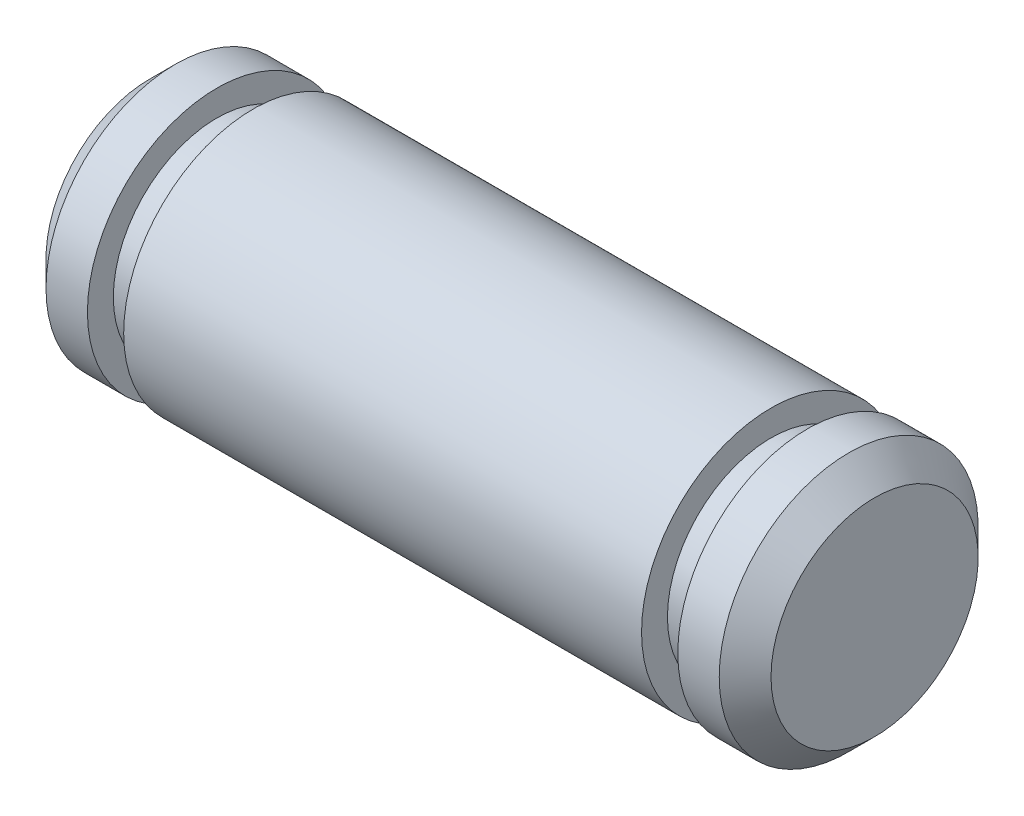
ISO-10303-21;
HEADER;
FILE_DESCRIPTION(('STEP AP214'),'2;1');
FILE_NAME('part.step','',(''),(''),'','','');
FILE_SCHEMA(('AUTOMOTIVE_DESIGN { 1 0 10303 214 1 1 1 1 }'));
ENDSEC;
DATA;
#1=APPLICATION_CONTEXT('core data for automotive mechanical design processes');
#2=APPLICATION_PROTOCOL_DEFINITION('international standard','automotive_design',2000,#1);
#3=PRODUCT_CONTEXT('',#1,'mechanical');
#4=PRODUCT('Part','Part','',(#3));
#5=PRODUCT_RELATED_PRODUCT_CATEGORY('part','',(#4));
#6=PRODUCT_DEFINITION_FORMATION('','',#4);
#7=PRODUCT_DEFINITION_CONTEXT('part definition',#1,'design');
#8=PRODUCT_DEFINITION('design','',#6,#7);
#9=PRODUCT_DEFINITION_SHAPE('','',#8);
#10=(LENGTH_UNIT() NAMED_UNIT(*) SI_UNIT(.MILLI.,.METRE.));
#11=(NAMED_UNIT(*) PLANE_ANGLE_UNIT() SI_UNIT($,.RADIAN.));
#12=(NAMED_UNIT(*) SI_UNIT($,.STERADIAN.) SOLID_ANGLE_UNIT());
#13=UNCERTAINTY_MEASURE_WITH_UNIT(LENGTH_MEASURE(1.E-05),#10,'distance_accuracy_value','');
#14=(GEOMETRIC_REPRESENTATION_CONTEXT(3) GLOBAL_UNCERTAINTY_ASSIGNED_CONTEXT((#13)) GLOBAL_UNIT_ASSIGNED_CONTEXT((#10,
#11,#12)) REPRESENTATION_CONTEXT('',''));
#15=CARTESIAN_POINT('',(0.,0.,0.));
#16=DIRECTION('',(0.,0.,1.));
#17=DIRECTION('',(1.,0.,0.));
#18=AXIS2_PLACEMENT_3D('',#15,#16,#17);
#19=CARTESIAN_POINT('',(14.,2.,0.));
#20=DIRECTION('',(-1.,0.,0.));
#21=DIRECTION('',(0.,0.,1.));
#22=AXIS2_PLACEMENT_3D('',#19,#20,#21);
#23=PLANE('',#22);
#24=CARTESIAN_POINT('',(14.00000000001,0.,0.));
#25=DIRECTION('',(-1.,0.,0.));
#26=DIRECTION('',(0.,0.,1.));
#27=AXIS2_PLACEMENT_3D('',#24,#25,#26);
#28=CIRCLE('',#27,1.99999999995271);
#29=CARTESIAN_POINT('',(14.00000000001,0.,1.99999999995271));
#30=VERTEX_POINT('',#29);
#31=EDGE_CURVE('E17',#30,#30,#28,.T.);
#32=ORIENTED_EDGE('',*,*,#31,.F.);
#33=EDGE_LOOP('',(#32));
#34=FACE_BOUND('',#33,.T.);
#35=ADVANCED_FACE('F14',(#34),#23,.F.);
#36=CARTESIAN_POINT('',(0.,0.,0.));
#37=DIRECTION('',(1.,0.,0.));
#38=DIRECTION('',(0.,0.,-1.));
#39=AXIS2_PLACEMENT_3D('',#36,#37,#38);
#40=PLANE('',#39);
#41=CARTESIAN_POINT('',(5.6843418860808E-11,0.,0.));
#42=DIRECTION('',(1.,0.,0.));
#43=DIRECTION('',(0.,0.,-1.));
#44=AXIS2_PLACEMENT_3D('',#41,#42,#43);
#45=CIRCLE('',#44,2.00000000000955);
#46=CARTESIAN_POINT('',(5.6843418860808E-11,0.,-2.00000000000955));
#47=VERTEX_POINT('',#46);
#48=EDGE_CURVE('E49',#47,#47,#45,.T.);
#49=ORIENTED_EDGE('',*,*,#48,.F.);
#50=EDGE_LOOP('',(#49));
#51=FACE_BOUND('',#50,.T.);
#52=ADVANCED_FACE('F61',(#51),#40,.F.);
#53=CARTESIAN_POINT('',(13.5000000000218,0.,0.));
#54=DIRECTION('',(-1.,0.,0.));
#55=DIRECTION('',(0.,0.,1.));
#56=AXIS2_PLACEMENT_3D('',#53,#54,#55);
#57=CONICAL_SURFACE('',#56,2.49999999994088,0.785398163397448);
#58=CARTESIAN_POINT('',(13.5,0.,0.));
#59=DIRECTION('',(-1.,0.,0.));
#60=DIRECTION('',(0.,0.,1.));
#61=AXIS2_PLACEMENT_3D('',#58,#59,#60);
#62=CIRCLE('',#61,2.5);
#63=CARTESIAN_POINT('',(13.5,0.,2.5));
#64=VERTEX_POINT('',#63);
#65=EDGE_CURVE('E51',#64,#64,#62,.T.);
#66=ORIENTED_EDGE('',*,*,#65,.F.);
#67=EDGE_LOOP('',(#66));
#68=FACE_BOUND('',#67,.T.);
#69=ORIENTED_EDGE('',*,*,#31,.T.);
#70=EDGE_LOOP('',(#69));
#71=FACE_BOUND('',#70,.T.);
#72=ADVANCED_FACE('F58',(#68,#71),#57,.T.);
#73=CARTESIAN_POINT('',(0.499999999988177,0.,0.));
#74=DIRECTION('',(1.,0.,0.));
#75=DIRECTION('',(0.,0.,-1.));
#76=AXIS2_PLACEMENT_3D('',#73,#74,#75);
#77=CONICAL_SURFACE('',#76,2.49999999994088,0.785398163397448);
#78=ORIENTED_EDGE('',*,*,#48,.T.);
#79=EDGE_LOOP('',(#78));
#80=FACE_BOUND('',#79,.T.);
#81=CARTESIAN_POINT('',(0.5,0.,0.));
#82=DIRECTION('',(-1.,0.,0.));
#83=DIRECTION('',(0.,0.,1.));
#84=AXIS2_PLACEMENT_3D('',#81,#82,#83);
#85=CIRCLE('',#84,2.5);
#86=CARTESIAN_POINT('',(0.5,0.,2.5));
#87=VERTEX_POINT('',#86);
#88=EDGE_CURVE('E48',#87,#87,#85,.F.);
#89=ORIENTED_EDGE('',*,*,#88,.F.);
#90=EDGE_LOOP('',(#89));
#91=FACE_BOUND('',#90,.T.);
#92=ADVANCED_FACE('F105',(#80,#91),#77,.T.);
#93=CARTESIAN_POINT('',(14.,0.,0.));
#94=DIRECTION('',(-1.,0.,0.));
#95=DIRECTION('',(0.,0.,1.));
#96=AXIS2_PLACEMENT_3D('',#93,#94,#95);
#97=CYLINDRICAL_SURFACE('',#96,2.5);
#98=CARTESIAN_POINT('',(12.7,0.,0.));
#99=DIRECTION('',(-1.,0.,0.));
#100=DIRECTION('',(0.,0.,1.));
#101=AXIS2_PLACEMENT_3D('',#98,#99,#100);
#102=CIRCLE('',#101,2.5);
#103=CARTESIAN_POINT('',(12.7,0.,2.5));
#104=VERTEX_POINT('',#103);
#105=EDGE_CURVE('E46',#104,#104,#102,.F.);
#106=ORIENTED_EDGE('',*,*,#105,.T.);
#107=EDGE_LOOP('',(#106));
#108=FACE_BOUND('',#107,.T.);
#109=ORIENTED_EDGE('',*,*,#65,.T.);
#110=EDGE_LOOP('',(#109));
#111=FACE_BOUND('',#110,.T.);
#112=ADVANCED_FACE('F101',(#108,#111),#97,.T.);
#113=CARTESIAN_POINT('',(14.,0.,0.));
#114=DIRECTION('',(-1.,0.,0.));
#115=DIRECTION('',(0.,0.,1.));
#116=AXIS2_PLACEMENT_3D('',#113,#114,#115);
#117=CYLINDRICAL_SURFACE('',#116,2.5);
#118=ORIENTED_EDGE('',*,*,#88,.T.);
#119=EDGE_LOOP('',(#118));
#120=FACE_BOUND('',#119,.T.);
#121=CARTESIAN_POINT('',(1.3,0.,0.));
#122=DIRECTION('',(-1.,0.,0.));
#123=DIRECTION('',(0.,0.,1.));
#124=AXIS2_PLACEMENT_3D('',#121,#122,#123);
#125=CIRCLE('',#124,2.5);
#126=CARTESIAN_POINT('',(1.3,0.,2.5));
#127=VERTEX_POINT('',#126);
#128=EDGE_CURVE('E43',#127,#127,#125,.T.);
#129=ORIENTED_EDGE('',*,*,#128,.T.);
#130=EDGE_LOOP('',(#129));
#131=FACE_BOUND('',#130,.T.);
#132=ADVANCED_FACE('F97',(#120,#131),#117,.T.);
#133=CARTESIAN_POINT('',(12.7,2.,0.));
#134=DIRECTION('',(1.,0.,0.));
#135=DIRECTION('',(0.,0.,-1.));
#136=AXIS2_PLACEMENT_3D('',#133,#134,#135);
#137=PLANE('',#136);
#138=CARTESIAN_POINT('',(12.7,0.,0.));
#139=DIRECTION('',(-1.,0.,0.));
#140=DIRECTION('',(0.,0.,1.));
#141=AXIS2_PLACEMENT_3D('',#138,#139,#140);
#142=CIRCLE('',#141,2.);
#143=CARTESIAN_POINT('',(12.7,0.,2.));
#144=VERTEX_POINT('',#143);
#145=EDGE_CURVE('E40',#144,#144,#142,.T.);
#146=ORIENTED_EDGE('',*,*,#145,.F.);
#147=EDGE_LOOP('',(#146));
#148=FACE_BOUND('',#147,.T.);
#149=ORIENTED_EDGE('',*,*,#105,.F.);
#150=EDGE_LOOP('',(#149));
#151=FACE_BOUND('',#150,.T.);
#152=ADVANCED_FACE('F93',(#148,#151),#137,.F.);
#153=CARTESIAN_POINT('',(1.3,2.5,0.));
#154=DIRECTION('',(-1.,0.,0.));
#155=DIRECTION('',(0.,0.,1.));
#156=AXIS2_PLACEMENT_3D('',#153,#154,#155);
#157=PLANE('',#156);
#158=ORIENTED_EDGE('',*,*,#128,.F.);
#159=EDGE_LOOP('',(#158));
#160=FACE_BOUND('',#159,.T.);
#161=CARTESIAN_POINT('',(1.3,0.,0.));
#162=DIRECTION('',(-1.,0.,0.));
#163=DIRECTION('',(0.,0.,1.));
#164=AXIS2_PLACEMENT_3D('',#161,#162,#163);
#165=CIRCLE('',#164,2.);
#166=CARTESIAN_POINT('',(1.3,0.,2.));
#167=VERTEX_POINT('',#166);
#168=EDGE_CURVE('E37',#167,#167,#165,.F.);
#169=ORIENTED_EDGE('',*,*,#168,.F.);
#170=EDGE_LOOP('',(#169));
#171=FACE_BOUND('',#170,.T.);
#172=ADVANCED_FACE('F89',(#160,#171),#157,.F.);
#173=CARTESIAN_POINT('',(14.,0.,0.));
#174=DIRECTION('',(-1.,0.,0.));
#175=DIRECTION('',(0.,0.,1.));
#176=AXIS2_PLACEMENT_3D('',#173,#174,#175);
#177=CYLINDRICAL_SURFACE('',#176,2.);
#178=CARTESIAN_POINT('',(12.,0.,0.));
#179=DIRECTION('',(-1.,0.,0.));
#180=DIRECTION('',(0.,0.,1.));
#181=AXIS2_PLACEMENT_3D('',#178,#179,#180);
#182=CIRCLE('',#181,2.);
#183=CARTESIAN_POINT('',(12.,0.,2.));
#184=VERTEX_POINT('',#183);
#185=EDGE_CURVE('E34',#184,#184,#182,.F.);
#186=ORIENTED_EDGE('',*,*,#185,.T.);
#187=EDGE_LOOP('',(#186));
#188=FACE_BOUND('',#187,.T.);
#189=ORIENTED_EDGE('',*,*,#145,.T.);
#190=EDGE_LOOP('',(#189));
#191=FACE_BOUND('',#190,.T.);
#192=ADVANCED_FACE('F85',(#188,#191),#177,.T.);
#193=CARTESIAN_POINT('',(14.,0.,0.));
#194=DIRECTION('',(-1.,0.,0.));
#195=DIRECTION('',(0.,0.,1.));
#196=AXIS2_PLACEMENT_3D('',#193,#194,#195);
#197=CYLINDRICAL_SURFACE('',#196,2.);
#198=ORIENTED_EDGE('',*,*,#168,.T.);
#199=EDGE_LOOP('',(#198));
#200=FACE_BOUND('',#199,.T.);
#201=CARTESIAN_POINT('',(2.,0.,0.));
#202=DIRECTION('',(-1.,0.,0.));
#203=DIRECTION('',(0.,0.,1.));
#204=AXIS2_PLACEMENT_3D('',#201,#202,#203);
#205=CIRCLE('',#204,2.);
#206=CARTESIAN_POINT('',(2.,0.,2.));
#207=VERTEX_POINT('',#206);
#208=EDGE_CURVE('E26',#207,#207,#205,.T.);
#209=ORIENTED_EDGE('',*,*,#208,.T.);
#210=EDGE_LOOP('',(#209));
#211=FACE_BOUND('',#210,.T.);
#212=ADVANCED_FACE('F81',(#200,#211),#197,.T.);
#213=CARTESIAN_POINT('',(12.,2.5,0.));
#214=DIRECTION('',(-1.,0.,0.));
#215=DIRECTION('',(0.,0.,1.));
#216=AXIS2_PLACEMENT_3D('',#213,#214,#215);
#217=PLANE('',#216);
#218=CARTESIAN_POINT('',(12.,0.,0.));
#219=DIRECTION('',(-1.,0.,0.));
#220=DIRECTION('',(0.,0.,1.));
#221=AXIS2_PLACEMENT_3D('',#218,#219,#220);
#222=CIRCLE('',#221,2.5);
#223=CARTESIAN_POINT('',(12.,0.,2.5));
#224=VERTEX_POINT('',#223);
#225=EDGE_CURVE('E21',#224,#224,#222,.T.);
#226=ORIENTED_EDGE('',*,*,#225,.F.);
#227=EDGE_LOOP('',(#226));
#228=FACE_BOUND('',#227,.T.);
#229=ORIENTED_EDGE('',*,*,#185,.F.);
#230=EDGE_LOOP('',(#229));
#231=FACE_BOUND('',#230,.T.);
#232=ADVANCED_FACE('F74',(#228,#231),#217,.F.);
#233=CARTESIAN_POINT('',(2.,2.,0.));
#234=DIRECTION('',(1.,0.,0.));
#235=DIRECTION('',(0.,0.,-1.));
#236=AXIS2_PLACEMENT_3D('',#233,#234,#235);
#237=PLANE('',#236);
#238=ORIENTED_EDGE('',*,*,#208,.F.);
#239=EDGE_LOOP('',(#238));
#240=FACE_BOUND('',#239,.T.);
#241=CARTESIAN_POINT('',(2.,0.,0.));
#242=DIRECTION('',(-1.,0.,0.));
#243=DIRECTION('',(0.,0.,1.));
#244=AXIS2_PLACEMENT_3D('',#241,#242,#243);
#245=CIRCLE('',#244,2.5);
#246=CARTESIAN_POINT('',(2.,0.,2.5));
#247=VERTEX_POINT('',#246);
#248=EDGE_CURVE('E10',#247,#247,#245,.F.);
#249=ORIENTED_EDGE('',*,*,#248,.F.);
#250=EDGE_LOOP('',(#249));
#251=FACE_BOUND('',#250,.T.);
#252=ADVANCED_FACE('F69',(#240,#251),#237,.F.);
#253=CARTESIAN_POINT('',(14.,0.,0.));
#254=DIRECTION('',(-1.,0.,0.));
#255=DIRECTION('',(0.,0.,1.));
#256=AXIS2_PLACEMENT_3D('',#253,#254,#255);
#257=CYLINDRICAL_SURFACE('',#256,2.5);
#258=ORIENTED_EDGE('',*,*,#248,.T.);
#259=EDGE_LOOP('',(#258));
#260=FACE_BOUND('',#259,.T.);
#261=ORIENTED_EDGE('',*,*,#225,.T.);
#262=EDGE_LOOP('',(#261));
#263=FACE_BOUND('',#262,.T.);
#264=ADVANCED_FACE('F67',(#260,#263),#257,.T.);
#265=CLOSED_SHELL('',(#35,#52,#72,#92,#112,#132,#152,#172,#192,#212,#232,#252,#264));
#266=MANIFOLD_SOLID_BREP('B1',#265);
#267=ADVANCED_BREP_SHAPE_REPRESENTATION('',(#18,#266),#14);
#268=SHAPE_DEFINITION_REPRESENTATION(#9,#267);
ENDSEC;
END-ISO-10303-21;
